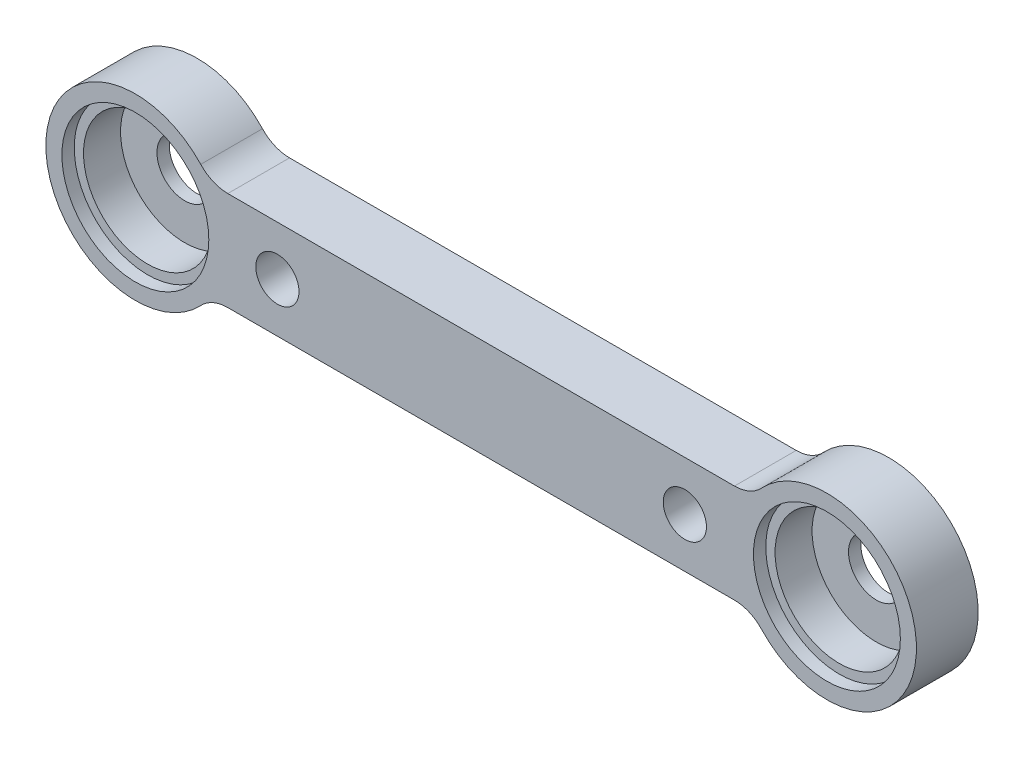
ISO-10303-21;
HEADER;
FILE_DESCRIPTION(('STEP AP214'),'2;1');
FILE_NAME('part.step','',(''),(''),'','','');
FILE_SCHEMA(('AUTOMOTIVE_DESIGN { 1 0 10303 214 1 1 1 1 }'));
ENDSEC;
DATA;
#1=APPLICATION_CONTEXT('core data for automotive mechanical design processes');
#2=APPLICATION_PROTOCOL_DEFINITION('international standard','automotive_design',2000,#1);
#3=PRODUCT_CONTEXT('',#1,'mechanical');
#4=PRODUCT('Part','Part','',(#3));
#5=PRODUCT_RELATED_PRODUCT_CATEGORY('part','',(#4));
#6=PRODUCT_DEFINITION_FORMATION('','',#4);
#7=PRODUCT_DEFINITION_CONTEXT('part definition',#1,'design');
#8=PRODUCT_DEFINITION('design','',#6,#7);
#9=PRODUCT_DEFINITION_SHAPE('','',#8);
#10=(LENGTH_UNIT() NAMED_UNIT(*) SI_UNIT(.MILLI.,.METRE.));
#11=(NAMED_UNIT(*) PLANE_ANGLE_UNIT() SI_UNIT($,.RADIAN.));
#12=(NAMED_UNIT(*) SI_UNIT($,.STERADIAN.) SOLID_ANGLE_UNIT());
#13=UNCERTAINTY_MEASURE_WITH_UNIT(LENGTH_MEASURE(1.E-05),#10,'distance_accuracy_value','');
#14=(GEOMETRIC_REPRESENTATION_CONTEXT(3) GLOBAL_UNCERTAINTY_ASSIGNED_CONTEXT((#13)) GLOBAL_UNIT_ASSIGNED_CONTEXT((#10,
#11,#12)) REPRESENTATION_CONTEXT('',''));
#15=CARTESIAN_POINT('',(0.,0.,0.));
#16=DIRECTION('',(0.,0.,1.));
#17=DIRECTION('',(1.,0.,0.));
#18=AXIS2_PLACEMENT_3D('',#15,#16,#17);
#19=CARTESIAN_POINT('',(-68.758315938752,0.,4.));
#20=DIRECTION('',(0.,0.,-1.));
#21=DIRECTION('',(-1.,0.,0.));
#22=AXIS2_PLACEMENT_3D('',#19,#20,#21);
#23=CYLINDRICAL_SURFACE('',#22,2.25);
#24=CARTESIAN_POINT('',(-68.758315938752,0.,0.));
#25=DIRECTION('',(0.,0.,-1.));
#26=DIRECTION('',(1.,0.,0.));
#27=AXIS2_PLACEMENT_3D('',#24,#25,#26);
#28=CIRCLE('',#27,2.25);
#29=CARTESIAN_POINT('',(-66.508315938752,0.,0.));
#30=VERTEX_POINT('',#29);
#31=EDGE_CURVE('E170',#30,#30,#28,.T.);
#32=ORIENTED_EDGE('',*,*,#31,.T.);
#33=EDGE_LOOP('',(#32));
#34=FACE_BOUND('',#33,.T.);
#35=CARTESIAN_POINT('',(-68.758315938752,0.,1.));
#36=DIRECTION('',(0.,0.,1.));
#37=DIRECTION('',(1.,0.,0.));
#38=AXIS2_PLACEMENT_3D('',#35,#36,#37);
#39=CIRCLE('',#38,2.25);
#40=CARTESIAN_POINT('',(-66.508315938752,0.,1.));
#41=VERTEX_POINT('',#40);
#42=EDGE_CURVE('E44',#41,#41,#39,.F.);
#43=ORIENTED_EDGE('',*,*,#42,.F.);
#44=EDGE_LOOP('',(#43));
#45=FACE_BOUND('',#44,.T.);
#46=ADVANCED_FACE('F40',(#34,#45),#23,.F.);
#47=CARTESIAN_POINT('',(-12.7483159387521,0.,4.));
#48=DIRECTION('',(0.,0.,-1.));
#49=DIRECTION('',(-1.,0.,0.));
#50=AXIS2_PLACEMENT_3D('',#47,#48,#49);
#51=CYLINDRICAL_SURFACE('',#50,2.25);
#52=CARTESIAN_POINT('',(-12.7483159387521,0.,0.));
#53=DIRECTION('',(0.,0.,-1.));
#54=DIRECTION('',(-1.,0.,0.));
#55=AXIS2_PLACEMENT_3D('',#52,#53,#54);
#56=CIRCLE('',#55,2.25);
#57=CARTESIAN_POINT('',(-14.9983159387521,0.,0.));
#58=VERTEX_POINT('',#57);
#59=EDGE_CURVE('E185',#58,#58,#56,.T.);
#60=ORIENTED_EDGE('',*,*,#59,.T.);
#61=EDGE_LOOP('',(#60));
#62=FACE_BOUND('',#61,.T.);
#63=CARTESIAN_POINT('',(-12.7483159387521,0.,1.));
#64=DIRECTION('',(0.,0.,1.));
#65=DIRECTION('',(1.,0.,0.));
#66=AXIS2_PLACEMENT_3D('',#63,#64,#65);
#67=CIRCLE('',#66,2.25);
#68=CARTESIAN_POINT('',(-10.4983159387521,0.,1.));
#69=VERTEX_POINT('',#68);
#70=EDGE_CURVE('E164',#69,#69,#67,.F.);
#71=ORIENTED_EDGE('',*,*,#70,.F.);
#72=EDGE_LOOP('',(#71));
#73=FACE_BOUND('',#72,.T.);
#74=ADVANCED_FACE('F252',(#62,#73),#51,.F.);
#75=CARTESIAN_POINT('',(-68.758315938752,0.,5.));
#76=DIRECTION('',(0.,0.,1.));
#77=DIRECTION('',(1.,0.,0.));
#78=AXIS2_PLACEMENT_3D('',#75,#76,#77);
#79=PLANE('',#78);
#80=CARTESIAN_POINT('',(-68.758315938752,0.,5.));
#81=DIRECTION('',(0.,0.,1.));
#82=DIRECTION('',(1.,0.,0.));
#83=AXIS2_PLACEMENT_3D('',#80,#81,#82);
#84=CIRCLE('',#83,5.94999999999999);
#85=CARTESIAN_POINT('',(-62.8083159387521,0.,5.));
#86=VERTEX_POINT('',#85);
#87=EDGE_CURVE('E195',#86,#86,#84,.T.);
#88=ORIENTED_EDGE('',*,*,#87,.F.);
#89=EDGE_LOOP('',(#88));
#90=FACE_BOUND('',#89,.T.);
#91=CARTESIAN_POINT('',(-12.7483159387521,0.,5.));
#92=DIRECTION('',(0.,0.,1.));
#93=DIRECTION('',(1.,0.,0.));
#94=AXIS2_PLACEMENT_3D('',#91,#92,#93);
#95=CIRCLE('',#94,5.95);
#96=CARTESIAN_POINT('',(-6.79831593875205,0.,5.));
#97=VERTEX_POINT('',#96);
#98=EDGE_CURVE('E198',#97,#97,#95,.T.);
#99=ORIENTED_EDGE('',*,*,#98,.F.);
#100=EDGE_LOOP('',(#99));
#101=FACE_BOUND('',#100,.T.);
#102=CARTESIAN_POINT('',(-68.758315938752,0.,5.));
#103=DIRECTION('',(0.,0.,-1.));
#104=DIRECTION('',(-1.,0.,0.));
#105=AXIS2_PLACEMENT_3D('',#102,#103,#104);
#106=CIRCLE('',#105,7.25000000000001);
#107=CARTESIAN_POINT('',(-63.4622867335778,-4.95121951219513,5.));
#108=VERTEX_POINT('',#107);
#109=CARTESIAN_POINT('',(-63.4622867335778,4.95121951219513,5.));
#110=VERTEX_POINT('',#109);
#111=EDGE_CURVE('E208',#108,#110,#106,.T.);
#112=ORIENTED_EDGE('',*,*,#111,.F.);
#113=CARTESIAN_POINT('',(-61.2708263728161,-7.,5.));
#114=DIRECTION('',(0.,0.,1.));
#115=DIRECTION('',(1.,0.,0.));
#116=AXIS2_PLACEMENT_3D('',#113,#114,#115);
#117=CIRCLE('',#116,3.);
#118=CARTESIAN_POINT('',(-61.2708263728161,-4.,5.));
#119=VERTEX_POINT('',#118);
#120=EDGE_CURVE('E112',#108,#119,#117,.F.);
#121=ORIENTED_EDGE('',*,*,#120,.T.);
#122=DIRECTION('',(1.,0.,0.));
#123=VECTOR('',#122,1.);
#124=CARTESIAN_POINT('',(-68.758315938752,-4.,5.));
#125=LINE('',#124,#123);
#126=CARTESIAN_POINT('',(-20.235805504688,-3.99999999999999,5.));
#127=VERTEX_POINT('',#126);
#128=EDGE_CURVE('E123',#119,#127,#125,.T.);
#129=ORIENTED_EDGE('',*,*,#128,.T.);
#130=CARTESIAN_POINT('',(-20.235805504688,-6.99999999999999,5.));
#131=DIRECTION('',(0.,0.,1.));
#132=DIRECTION('',(1.,0.,0.));
#133=AXIS2_PLACEMENT_3D('',#130,#131,#132);
#134=CIRCLE('',#133,3.);
#135=CARTESIAN_POINT('',(-18.0443451439263,-4.95121951219512,5.));
#136=VERTEX_POINT('',#135);
#137=EDGE_CURVE('E157',#127,#136,#134,.F.);
#138=ORIENTED_EDGE('',*,*,#137,.T.);
#139=CARTESIAN_POINT('',(-12.7483159387521,0.,5.));
#140=DIRECTION('',(0.,0.,-1.));
#141=DIRECTION('',(1.,0.,0.));
#142=AXIS2_PLACEMENT_3D('',#139,#140,#141);
#143=CIRCLE('',#142,7.25);
#144=CARTESIAN_POINT('',(-18.0443451439263,4.95121951219513,5.));
#145=VERTEX_POINT('',#144);
#146=EDGE_CURVE('E194',#145,#136,#143,.T.);
#147=ORIENTED_EDGE('',*,*,#146,.F.);
#148=CARTESIAN_POINT('',(-20.235805504688,7.00000000000001,5.));
#149=DIRECTION('',(0.,0.,1.));
#150=DIRECTION('',(1.,0.,0.));
#151=AXIS2_PLACEMENT_3D('',#148,#149,#150);
#152=CIRCLE('',#151,3.);
#153=CARTESIAN_POINT('',(-20.235805504688,4.00000000000001,5.));
#154=VERTEX_POINT('',#153);
#155=EDGE_CURVE('E113',#145,#154,#152,.F.);
#156=ORIENTED_EDGE('',*,*,#155,.T.);
#157=DIRECTION('',(-1.,0.,0.));
#158=VECTOR('',#157,1.);
#159=CARTESIAN_POINT('',(-68.758315938752,4.,5.));
#160=LINE('',#159,#158);
#161=CARTESIAN_POINT('',(-61.2708263728161,4.,5.));
#162=VERTEX_POINT('',#161);
#163=EDGE_CURVE('E125',#154,#162,#160,.T.);
#164=ORIENTED_EDGE('',*,*,#163,.T.);
#165=CARTESIAN_POINT('',(-61.2708263728161,7.,5.));
#166=DIRECTION('',(0.,0.,1.));
#167=DIRECTION('',(1.,0.,0.));
#168=AXIS2_PLACEMENT_3D('',#165,#166,#167);
#169=CIRCLE('',#168,3.);
#170=EDGE_CURVE('E49',#162,#110,#169,.F.);
#171=ORIENTED_EDGE('',*,*,#170,.T.);
#172=EDGE_LOOP('',(#112,#121,#129,#138,#147,#156,#164,#171));
#173=FACE_BOUND('',#172,.T.);
#174=CARTESIAN_POINT('',(-57.253315938752,0.,5.));
#175=DIRECTION('',(0.,0.,1.));
#176=DIRECTION('',(1.,0.,0.));
#177=AXIS2_PLACEMENT_3D('',#174,#175,#176);
#178=CIRCLE('',#177,1.75);
#179=CARTESIAN_POINT('',(-55.503315938752,0.,5.));
#180=VERTEX_POINT('',#179);
#181=EDGE_CURVE('E134',#180,#180,#178,.T.);
#182=ORIENTED_EDGE('',*,*,#181,.F.);
#183=EDGE_LOOP('',(#182));
#184=FACE_BOUND('',#183,.T.);
#185=CARTESIAN_POINT('',(-24.253315938752,0.,5.));
#186=DIRECTION('',(0.,0.,1.));
#187=DIRECTION('',(-1.,0.,0.));
#188=AXIS2_PLACEMENT_3D('',#185,#186,#187);
#189=CIRCLE('',#188,1.75);
#190=CARTESIAN_POINT('',(-26.003315938752,0.,5.));
#191=VERTEX_POINT('',#190);
#192=EDGE_CURVE('E212',#191,#191,#189,.T.);
#193=ORIENTED_EDGE('',*,*,#192,.F.);
#194=EDGE_LOOP('',(#193));
#195=FACE_BOUND('',#194,.T.);
#196=ADVANCED_FACE('F222',(#90,#101,#173,#184,#195),#79,.T.);
#197=CARTESIAN_POINT('',(-68.758315938752,0.,0.));
#198=DIRECTION('',(0.,0.,1.));
#199=DIRECTION('',(1.,0.,0.));
#200=AXIS2_PLACEMENT_3D('',#197,#198,#199);
#201=PLANE('',#200);
#202=ORIENTED_EDGE('',*,*,#59,.F.);
#203=EDGE_LOOP('',(#202));
#204=FACE_BOUND('',#203,.T.);
#205=ORIENTED_EDGE('',*,*,#31,.F.);
#206=EDGE_LOOP('',(#205));
#207=FACE_BOUND('',#206,.T.);
#208=DIRECTION('',(-1.,0.,0.));
#209=VECTOR('',#208,1.);
#210=CARTESIAN_POINT('',(-68.758315938752,4.,0.));
#211=LINE('',#210,#209);
#212=CARTESIAN_POINT('',(-20.235805504688,4.00000000000001,0.));
#213=VERTEX_POINT('',#212);
#214=CARTESIAN_POINT('',(-61.2708263728161,4.,0.));
#215=VERTEX_POINT('',#214);
#216=EDGE_CURVE('E133',#213,#215,#211,.T.);
#217=ORIENTED_EDGE('',*,*,#216,.F.);
#218=CARTESIAN_POINT('',(-20.235805504688,7.00000000000001,0.));
#219=DIRECTION('',(0.,0.,1.));
#220=DIRECTION('',(1.,0.,0.));
#221=AXIS2_PLACEMENT_3D('',#218,#219,#220);
#222=CIRCLE('',#221,3.);
#223=CARTESIAN_POINT('',(-18.0443451439263,4.95121951219513,0.));
#224=VERTEX_POINT('',#223);
#225=EDGE_CURVE('E160',#213,#224,#222,.T.);
#226=ORIENTED_EDGE('',*,*,#225,.T.);
#227=CARTESIAN_POINT('',(-12.7483159387521,0.,0.));
#228=DIRECTION('',(0.,0.,-1.));
#229=DIRECTION('',(1.,0.,0.));
#230=AXIS2_PLACEMENT_3D('',#227,#228,#229);
#231=CIRCLE('',#230,7.25);
#232=CARTESIAN_POINT('',(-18.0443451439263,-4.95121951219512,0.));
#233=VERTEX_POINT('',#232);
#234=EDGE_CURVE('E203',#224,#233,#231,.T.);
#235=ORIENTED_EDGE('',*,*,#234,.T.);
#236=CARTESIAN_POINT('',(-20.235805504688,-6.99999999999999,0.));
#237=DIRECTION('',(0.,0.,1.));
#238=DIRECTION('',(1.,0.,0.));
#239=AXIS2_PLACEMENT_3D('',#236,#237,#238);
#240=CIRCLE('',#239,3.);
#241=CARTESIAN_POINT('',(-20.235805504688,-3.99999999999999,0.));
#242=VERTEX_POINT('',#241);
#243=EDGE_CURVE('E132',#233,#242,#240,.T.);
#244=ORIENTED_EDGE('',*,*,#243,.T.);
#245=DIRECTION('',(1.,0.,0.));
#246=VECTOR('',#245,1.);
#247=CARTESIAN_POINT('',(-68.758315938752,-4.,0.));
#248=LINE('',#247,#246);
#249=CARTESIAN_POINT('',(-61.2708263728161,-4.,0.));
#250=VERTEX_POINT('',#249);
#251=EDGE_CURVE('E120',#250,#242,#248,.T.);
#252=ORIENTED_EDGE('',*,*,#251,.F.);
#253=CARTESIAN_POINT('',(-61.2708263728161,-7.,0.));
#254=DIRECTION('',(0.,0.,1.));
#255=DIRECTION('',(1.,0.,0.));
#256=AXIS2_PLACEMENT_3D('',#253,#254,#255);
#257=CIRCLE('',#256,3.);
#258=CARTESIAN_POINT('',(-63.4622867335778,-4.95121951219513,0.));
#259=VERTEX_POINT('',#258);
#260=EDGE_CURVE('E64',#250,#259,#257,.T.);
#261=ORIENTED_EDGE('',*,*,#260,.T.);
#262=CARTESIAN_POINT('',(-68.758315938752,0.,0.));
#263=DIRECTION('',(0.,0.,-1.));
#264=DIRECTION('',(-1.,0.,0.));
#265=AXIS2_PLACEMENT_3D('',#262,#263,#264);
#266=CIRCLE('',#265,7.25000000000001);
#267=CARTESIAN_POINT('',(-63.4622867335778,4.95121951219513,0.));
#268=VERTEX_POINT('',#267);
#269=EDGE_CURVE('E205',#259,#268,#266,.T.);
#270=ORIENTED_EDGE('',*,*,#269,.T.);
#271=CARTESIAN_POINT('',(-61.2708263728161,7.,0.));
#272=DIRECTION('',(0.,0.,1.));
#273=DIRECTION('',(1.,0.,0.));
#274=AXIS2_PLACEMENT_3D('',#271,#272,#273);
#275=CIRCLE('',#274,3.);
#276=EDGE_CURVE('E11',#268,#215,#275,.T.);
#277=ORIENTED_EDGE('',*,*,#276,.T.);
#278=EDGE_LOOP('',(#217,#226,#235,#244,#252,#261,#270,#277));
#279=FACE_BOUND('',#278,.T.);
#280=CARTESIAN_POINT('',(-57.253315938752,0.,0.));
#281=DIRECTION('',(0.,0.,1.));
#282=DIRECTION('',(1.,0.,0.));
#283=AXIS2_PLACEMENT_3D('',#280,#281,#282);
#284=CIRCLE('',#283,1.75);
#285=CARTESIAN_POINT('',(-55.503315938752,0.,0.));
#286=VERTEX_POINT('',#285);
#287=EDGE_CURVE('E139',#286,#286,#284,.T.);
#288=ORIENTED_EDGE('',*,*,#287,.T.);
#289=EDGE_LOOP('',(#288));
#290=FACE_BOUND('',#289,.T.);
#291=CARTESIAN_POINT('',(-24.253315938752,0.,0.));
#292=DIRECTION('',(0.,0.,1.));
#293=DIRECTION('',(-1.,0.,0.));
#294=AXIS2_PLACEMENT_3D('',#291,#292,#293);
#295=CIRCLE('',#294,1.75);
#296=CARTESIAN_POINT('',(-26.003315938752,0.,0.));
#297=VERTEX_POINT('',#296);
#298=EDGE_CURVE('E210',#297,#297,#295,.T.);
#299=ORIENTED_EDGE('',*,*,#298,.T.);
#300=EDGE_LOOP('',(#299));
#301=FACE_BOUND('',#300,.T.);
#302=ADVANCED_FACE('F128',(#204,#207,#279,#290,#301),#201,.F.);
#303=CARTESIAN_POINT('',(-68.758315938752,-4.,5.));
#304=DIRECTION('',(0.,1.,0.));
#305=DIRECTION('',(-1.,0.,0.));
#306=AXIS2_PLACEMENT_3D('',#303,#304,#305);
#307=PLANE('',#306);
#308=ORIENTED_EDGE('',*,*,#251,.T.);
#309=DIRECTION('',(0.,0.,-1.));
#310=VECTOR('',#309,1.);
#311=CARTESIAN_POINT('',(-20.235805504688,-3.99999999999999,5.));
#312=LINE('',#311,#310);
#313=EDGE_CURVE('E124',#242,#127,#312,.F.);
#314=ORIENTED_EDGE('',*,*,#313,.T.);
#315=ORIENTED_EDGE('',*,*,#128,.F.);
#316=DIRECTION('',(0.,0.,-1.));
#317=VECTOR('',#316,1.);
#318=CARTESIAN_POINT('',(-61.2708263728161,-4.,5.));
#319=LINE('',#318,#317);
#320=EDGE_CURVE('E110',#119,#250,#319,.T.);
#321=ORIENTED_EDGE('',*,*,#320,.T.);
#322=EDGE_LOOP('',(#308,#314,#315,#321));
#323=FACE_BOUND('',#322,.T.);
#324=ADVANCED_FACE('F118',(#323),#307,.F.);
#325=CARTESIAN_POINT('',(-68.758315938752,4.,5.));
#326=DIRECTION('',(0.,-1.,0.));
#327=DIRECTION('',(1.,0.,0.));
#328=AXIS2_PLACEMENT_3D('',#325,#326,#327);
#329=PLANE('',#328);
#330=ORIENTED_EDGE('',*,*,#163,.F.);
#331=DIRECTION('',(0.,0.,-1.));
#332=VECTOR('',#331,1.);
#333=CARTESIAN_POINT('',(-20.235805504688,4.00000000000001,5.));
#334=LINE('',#333,#332);
#335=EDGE_CURVE('E152',#154,#213,#334,.T.);
#336=ORIENTED_EDGE('',*,*,#335,.T.);
#337=ORIENTED_EDGE('',*,*,#216,.T.);
#338=DIRECTION('',(0.,0.,-1.));
#339=VECTOR('',#338,1.);
#340=CARTESIAN_POINT('',(-61.2708263728161,4.,5.));
#341=LINE('',#340,#339);
#342=EDGE_CURVE('E149',#215,#162,#341,.F.);
#343=ORIENTED_EDGE('',*,*,#342,.T.);
#344=EDGE_LOOP('',(#330,#336,#337,#343));
#345=FACE_BOUND('',#344,.T.);
#346=ADVANCED_FACE('F228',(#345),#329,.F.);
#347=CARTESIAN_POINT('',(-57.253315938752,0.,5.));
#348=DIRECTION('',(0.,0.,-1.));
#349=DIRECTION('',(-1.,0.,0.));
#350=AXIS2_PLACEMENT_3D('',#347,#348,#349);
#351=CYLINDRICAL_SURFACE('',#350,1.75);
#352=ORIENTED_EDGE('',*,*,#181,.T.);
#353=EDGE_LOOP('',(#352));
#354=FACE_BOUND('',#353,.T.);
#355=ORIENTED_EDGE('',*,*,#287,.F.);
#356=EDGE_LOOP('',(#355));
#357=FACE_BOUND('',#356,.T.);
#358=ADVANCED_FACE('F282',(#354,#357),#351,.F.);
#359=CARTESIAN_POINT('',(-24.253315938752,0.,5.));
#360=DIRECTION('',(0.,0.,-1.));
#361=DIRECTION('',(-1.,0.,0.));
#362=AXIS2_PLACEMENT_3D('',#359,#360,#361);
#363=CYLINDRICAL_SURFACE('',#362,1.75);
#364=ORIENTED_EDGE('',*,*,#192,.T.);
#365=EDGE_LOOP('',(#364));
#366=FACE_BOUND('',#365,.T.);
#367=ORIENTED_EDGE('',*,*,#298,.F.);
#368=EDGE_LOOP('',(#367));
#369=FACE_BOUND('',#368,.T.);
#370=ADVANCED_FACE('F279',(#366,#369),#363,.F.);
#371=CARTESIAN_POINT('',(-68.758315938752,0.,5.));
#372=DIRECTION('',(0.,0.,-1.));
#373=DIRECTION('',(-1.,0.,0.));
#374=AXIS2_PLACEMENT_3D('',#371,#372,#373);
#375=CYLINDRICAL_SURFACE('',#374,7.25000000000001);
#376=ORIENTED_EDGE('',*,*,#269,.F.);
#377=DIRECTION('',(0.,0.,-1.));
#378=VECTOR('',#377,1.);
#379=CARTESIAN_POINT('',(-63.4622867335778,-4.95121951219513,5.));
#380=LINE('',#379,#378);
#381=EDGE_CURVE('E111',#259,#108,#380,.F.);
#382=ORIENTED_EDGE('',*,*,#381,.T.);
#383=ORIENTED_EDGE('',*,*,#111,.T.);
#384=DIRECTION('',(0.,0.,-1.));
#385=VECTOR('',#384,1.);
#386=CARTESIAN_POINT('',(-63.4622867335778,4.95121951219513,5.));
#387=LINE('',#386,#385);
#388=EDGE_CURVE('E57',#110,#268,#387,.T.);
#389=ORIENTED_EDGE('',*,*,#388,.T.);
#390=EDGE_LOOP('',(#376,#382,#383,#389));
#391=FACE_BOUND('',#390,.T.);
#392=ADVANCED_FACE('F276',(#391),#375,.T.);
#393=CARTESIAN_POINT('',(-12.7483159387521,0.,5.));
#394=DIRECTION('',(0.,0.,-1.));
#395=DIRECTION('',(-1.,0.,0.));
#396=AXIS2_PLACEMENT_3D('',#393,#394,#395);
#397=CYLINDRICAL_SURFACE('',#396,7.25);
#398=ORIENTED_EDGE('',*,*,#146,.T.);
#399=DIRECTION('',(0.,0.,-1.));
#400=VECTOR('',#399,1.);
#401=CARTESIAN_POINT('',(-18.0443451439263,-4.95121951219512,5.));
#402=LINE('',#401,#400);
#403=EDGE_CURVE('E147',#136,#233,#402,.T.);
#404=ORIENTED_EDGE('',*,*,#403,.T.);
#405=ORIENTED_EDGE('',*,*,#234,.F.);
#406=DIRECTION('',(0.,0.,-1.));
#407=VECTOR('',#406,1.);
#408=CARTESIAN_POINT('',(-18.0443451439263,4.95121951219512,5.));
#409=LINE('',#408,#407);
#410=EDGE_CURVE('E145',#224,#145,#409,.F.);
#411=ORIENTED_EDGE('',*,*,#410,.T.);
#412=EDGE_LOOP('',(#398,#404,#405,#411));
#413=FACE_BOUND('',#412,.T.);
#414=ADVANCED_FACE('F235',(#413),#397,.T.);
#415=CARTESIAN_POINT('',(-12.7483159387521,0.,4.));
#416=DIRECTION('',(0.,0.,1.));
#417=DIRECTION('',(1.,0.,0.));
#418=AXIS2_PLACEMENT_3D('',#415,#416,#417);
#419=CYLINDRICAL_SURFACE('',#418,5.95);
#420=CARTESIAN_POINT('',(-12.7483159387521,0.,4.));
#421=DIRECTION('',(0.,0.,1.));
#422=DIRECTION('',(1.,0.,0.));
#423=AXIS2_PLACEMENT_3D('',#420,#421,#422);
#424=CIRCLE('',#423,5.95);
#425=CARTESIAN_POINT('',(-6.79831593875205,0.,4.));
#426=VERTEX_POINT('',#425);
#427=EDGE_CURVE('E188',#426,#426,#424,.T.);
#428=ORIENTED_EDGE('',*,*,#427,.F.);
#429=EDGE_LOOP('',(#428));
#430=FACE_BOUND('',#429,.T.);
#431=ORIENTED_EDGE('',*,*,#98,.T.);
#432=EDGE_LOOP('',(#431));
#433=FACE_BOUND('',#432,.T.);
#434=ADVANCED_FACE('F267',(#430,#433),#419,.F.);
#435=CARTESIAN_POINT('',(-12.7483159387521,0.,4.));
#436=DIRECTION('',(0.,0.,1.));
#437=DIRECTION('',(1.,0.,0.));
#438=AXIS2_PLACEMENT_3D('',#435,#436,#437);
#439=PLANE('',#438);
#440=CARTESIAN_POINT('',(-12.7483159387521,0.,4.));
#441=DIRECTION('',(0.,0.,1.));
#442=DIRECTION('',(1.,0.,0.));
#443=AXIS2_PLACEMENT_3D('',#440,#441,#442);
#444=CIRCLE('',#443,5.2);
#445=CARTESIAN_POINT('',(-7.54831593875205,0.,4.));
#446=VERTEX_POINT('',#445);
#447=EDGE_CURVE('E177',#446,#446,#444,.T.);
#448=ORIENTED_EDGE('',*,*,#447,.F.);
#449=EDGE_LOOP('',(#448));
#450=FACE_BOUND('',#449,.T.);
#451=ORIENTED_EDGE('',*,*,#427,.T.);
#452=EDGE_LOOP('',(#451));
#453=FACE_BOUND('',#452,.T.);
#454=ADVANCED_FACE('F265',(#450,#453),#439,.T.);
#455=CARTESIAN_POINT('',(-68.758315938752,0.,4.));
#456=DIRECTION('',(0.,0.,1.));
#457=DIRECTION('',(1.,0.,0.));
#458=AXIS2_PLACEMENT_3D('',#455,#456,#457);
#459=CYLINDRICAL_SURFACE('',#458,5.94999999999999);
#460=CARTESIAN_POINT('',(-68.758315938752,0.,4.));
#461=DIRECTION('',(0.,0.,1.));
#462=DIRECTION('',(1.,0.,0.));
#463=AXIS2_PLACEMENT_3D('',#460,#461,#462);
#464=CIRCLE('',#463,5.94999999999999);
#465=CARTESIAN_POINT('',(-62.8083159387521,0.,4.));
#466=VERTEX_POINT('',#465);
#467=EDGE_CURVE('E191',#466,#466,#464,.T.);
#468=ORIENTED_EDGE('',*,*,#467,.F.);
#469=EDGE_LOOP('',(#468));
#470=FACE_BOUND('',#469,.T.);
#471=ORIENTED_EDGE('',*,*,#87,.T.);
#472=EDGE_LOOP('',(#471));
#473=FACE_BOUND('',#472,.T.);
#474=ADVANCED_FACE('F247',(#470,#473),#459,.F.);
#475=CARTESIAN_POINT('',(-68.758315938752,0.,4.));
#476=DIRECTION('',(0.,0.,1.));
#477=DIRECTION('',(1.,0.,0.));
#478=AXIS2_PLACEMENT_3D('',#475,#476,#477);
#479=PLANE('',#478);
#480=CARTESIAN_POINT('',(-68.758315938752,0.,4.));
#481=DIRECTION('',(0.,0.,1.));
#482=DIRECTION('',(1.,0.,0.));
#483=AXIS2_PLACEMENT_3D('',#480,#481,#482);
#484=CIRCLE('',#483,5.19999999999999);
#485=CARTESIAN_POINT('',(-63.5583159387521,0.,4.));
#486=VERTEX_POINT('',#485);
#487=EDGE_CURVE('E172',#486,#486,#484,.T.);
#488=ORIENTED_EDGE('',*,*,#487,.F.);
#489=EDGE_LOOP('',(#488));
#490=FACE_BOUND('',#489,.T.);
#491=ORIENTED_EDGE('',*,*,#467,.T.);
#492=EDGE_LOOP('',(#491));
#493=FACE_BOUND('',#492,.T.);
#494=ADVANCED_FACE('F240',(#490,#493),#479,.T.);
#495=CARTESIAN_POINT('',(-20.235805504688,-6.99999999999999,5.));
#496=DIRECTION('',(0.,0.,-1.));
#497=DIRECTION('',(-1.,0.,0.));
#498=AXIS2_PLACEMENT_3D('',#495,#496,#497);
#499=CYLINDRICAL_SURFACE('',#498,3.);
#500=ORIENTED_EDGE('',*,*,#243,.F.);
#501=ORIENTED_EDGE('',*,*,#403,.F.);
#502=ORIENTED_EDGE('',*,*,#137,.F.);
#503=ORIENTED_EDGE('',*,*,#313,.F.);
#504=EDGE_LOOP('',(#500,#501,#502,#503));
#505=FACE_BOUND('',#504,.T.);
#506=ADVANCED_FACE('F238',(#505),#499,.F.);
#507=CARTESIAN_POINT('',(-20.235805504688,7.00000000000001,5.));
#508=DIRECTION('',(0.,0.,-1.));
#509=DIRECTION('',(-1.,0.,0.));
#510=AXIS2_PLACEMENT_3D('',#507,#508,#509);
#511=CYLINDRICAL_SURFACE('',#510,3.);
#512=ORIENTED_EDGE('',*,*,#155,.F.);
#513=ORIENTED_EDGE('',*,*,#410,.F.);
#514=ORIENTED_EDGE('',*,*,#225,.F.);
#515=ORIENTED_EDGE('',*,*,#335,.F.);
#516=EDGE_LOOP('',(#512,#513,#514,#515));
#517=FACE_BOUND('',#516,.T.);
#518=ADVANCED_FACE('F231',(#517),#511,.F.);
#519=CARTESIAN_POINT('',(-61.2708263728161,-7.,5.));
#520=DIRECTION('',(0.,0.,-1.));
#521=DIRECTION('',(-1.,0.,0.));
#522=AXIS2_PLACEMENT_3D('',#519,#520,#521);
#523=CYLINDRICAL_SURFACE('',#522,3.);
#524=ORIENTED_EDGE('',*,*,#120,.F.);
#525=ORIENTED_EDGE('',*,*,#381,.F.);
#526=ORIENTED_EDGE('',*,*,#260,.F.);
#527=ORIENTED_EDGE('',*,*,#320,.F.);
#528=EDGE_LOOP('',(#524,#525,#526,#527));
#529=FACE_BOUND('',#528,.T.);
#530=ADVANCED_FACE('F109',(#529),#523,.F.);
#531=CARTESIAN_POINT('',(-61.2708263728161,7.,5.));
#532=DIRECTION('',(0.,0.,-1.));
#533=DIRECTION('',(-1.,0.,0.));
#534=AXIS2_PLACEMENT_3D('',#531,#532,#533);
#535=CYLINDRICAL_SURFACE('',#534,3.);
#536=ORIENTED_EDGE('',*,*,#276,.F.);
#537=ORIENTED_EDGE('',*,*,#388,.F.);
#538=ORIENTED_EDGE('',*,*,#170,.F.);
#539=ORIENTED_EDGE('',*,*,#342,.F.);
#540=EDGE_LOOP('',(#536,#537,#538,#539));
#541=FACE_BOUND('',#540,.T.);
#542=ADVANCED_FACE('F42',(#541),#535,.F.);
#543=CARTESIAN_POINT('',(-12.7483159387521,0.,1.));
#544=DIRECTION('',(0.,0.,1.));
#545=DIRECTION('',(1.,0.,0.));
#546=AXIS2_PLACEMENT_3D('',#543,#544,#545);
#547=PLANE('',#546);
#548=CARTESIAN_POINT('',(-12.7483159387521,0.,1.));
#549=DIRECTION('',(0.,0.,1.));
#550=DIRECTION('',(1.,0.,0.));
#551=AXIS2_PLACEMENT_3D('',#548,#549,#550);
#552=CIRCLE('',#551,5.2);
#553=CARTESIAN_POINT('',(-7.54831593875205,0.,1.));
#554=VERTEX_POINT('',#553);
#555=EDGE_CURVE('E182',#554,#554,#552,.T.);
#556=ORIENTED_EDGE('',*,*,#555,.T.);
#557=EDGE_LOOP('',(#556));
#558=FACE_BOUND('',#557,.T.);
#559=ORIENTED_EDGE('',*,*,#70,.T.);
#560=EDGE_LOOP('',(#559));
#561=FACE_BOUND('',#560,.T.);
#562=ADVANCED_FACE('F345',(#558,#561),#547,.T.);
#563=CARTESIAN_POINT('',(-12.7483159387521,0.,1.));
#564=DIRECTION('',(0.,0.,1.));
#565=DIRECTION('',(1.,0.,0.));
#566=AXIS2_PLACEMENT_3D('',#563,#564,#565);
#567=CYLINDRICAL_SURFACE('',#566,5.2);
#568=ORIENTED_EDGE('',*,*,#555,.F.);
#569=EDGE_LOOP('',(#568));
#570=FACE_BOUND('',#569,.T.);
#571=ORIENTED_EDGE('',*,*,#447,.T.);
#572=EDGE_LOOP('',(#571));
#573=FACE_BOUND('',#572,.T.);
#574=ADVANCED_FACE('F350',(#570,#573),#567,.F.);
#575=CARTESIAN_POINT('',(-68.758315938752,0.,1.));
#576=DIRECTION('',(0.,0.,1.));
#577=DIRECTION('',(1.,0.,0.));
#578=AXIS2_PLACEMENT_3D('',#575,#576,#577);
#579=PLANE('',#578);
#580=CARTESIAN_POINT('',(-68.758315938752,0.,1.));
#581=DIRECTION('',(0.,0.,1.));
#582=DIRECTION('',(1.,0.,0.));
#583=AXIS2_PLACEMENT_3D('',#580,#581,#582);
#584=CIRCLE('',#583,5.19999999999999);
#585=CARTESIAN_POINT('',(-63.5583159387521,0.,1.));
#586=VERTEX_POINT('',#585);
#587=EDGE_CURVE('E166',#586,#586,#584,.T.);
#588=ORIENTED_EDGE('',*,*,#587,.T.);
#589=EDGE_LOOP('',(#588));
#590=FACE_BOUND('',#589,.T.);
#591=ORIENTED_EDGE('',*,*,#42,.T.);
#592=EDGE_LOOP('',(#591));
#593=FACE_BOUND('',#592,.T.);
#594=ADVANCED_FACE('F362',(#590,#593),#579,.T.);
#595=CARTESIAN_POINT('',(-68.758315938752,0.,1.));
#596=DIRECTION('',(0.,0.,1.));
#597=DIRECTION('',(1.,0.,0.));
#598=AXIS2_PLACEMENT_3D('',#595,#596,#597);
#599=CYLINDRICAL_SURFACE('',#598,5.19999999999999);
#600=ORIENTED_EDGE('',*,*,#587,.F.);
#601=EDGE_LOOP('',(#600));
#602=FACE_BOUND('',#601,.T.);
#603=ORIENTED_EDGE('',*,*,#487,.T.);
#604=EDGE_LOOP('',(#603));
#605=FACE_BOUND('',#604,.T.);
#606=ADVANCED_FACE('F373',(#602,#605),#599,.F.);
#607=CLOSED_SHELL('',(#46,#74,#196,#302,#324,#346,#358,#370,#392,#414,#434,#454,#474,#494,#506,
#518,#530,#542,#562,#574,#594,#606));
#608=MANIFOLD_SOLID_BREP('B2',#607);
#609=ADVANCED_BREP_SHAPE_REPRESENTATION('',(#18,#608),#14);
#610=SHAPE_DEFINITION_REPRESENTATION(#9,#609);
ENDSEC;
END-ISO-10303-21;
